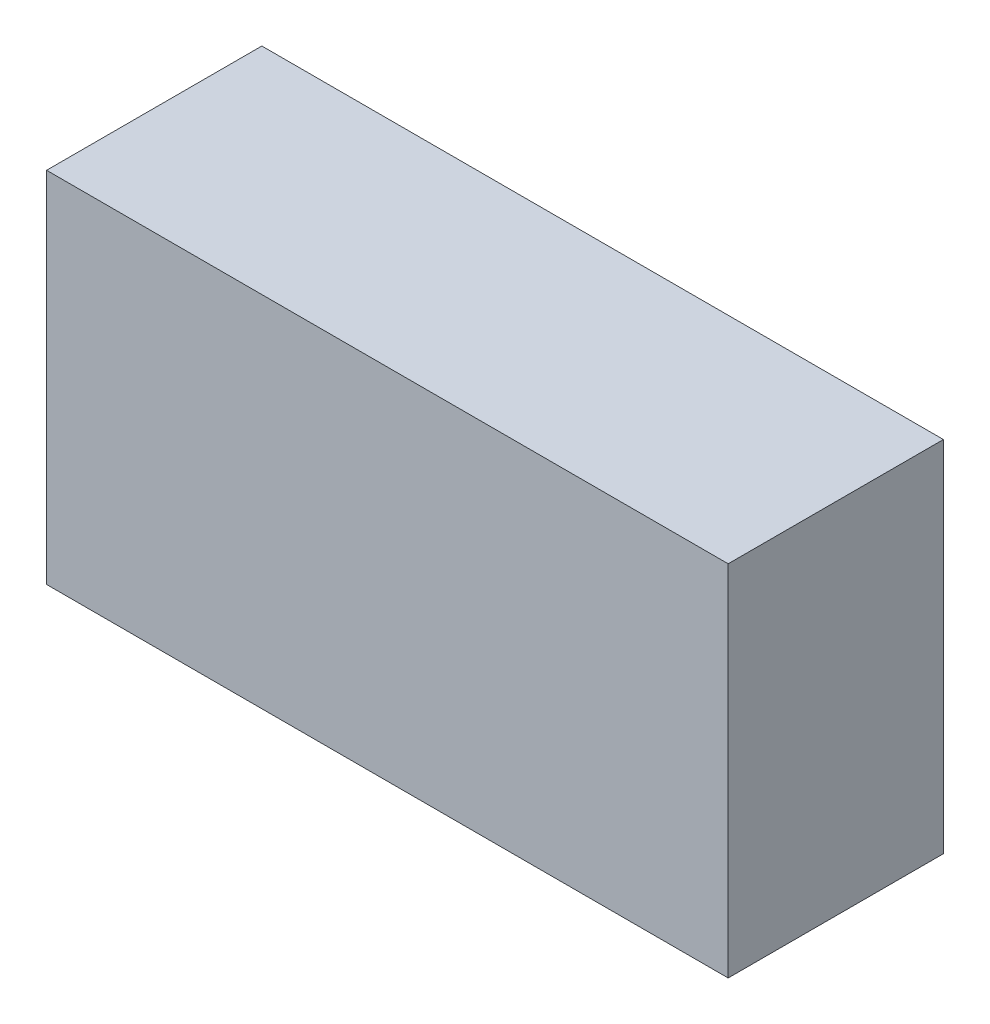
ISO-10303-21;
HEADER;
FILE_DESCRIPTION(('STEP AP214'),'2;1');
FILE_NAME('part.step','',(''),(''),'','','');
FILE_SCHEMA(('AUTOMOTIVE_DESIGN { 1 0 10303 214 1 1 1 1 }'));
ENDSEC;
DATA;
#1=APPLICATION_CONTEXT('core data for automotive mechanical design processes');
#2=APPLICATION_PROTOCOL_DEFINITION('international standard','automotive_design',2000,#1);
#3=PRODUCT_CONTEXT('',#1,'mechanical');
#4=PRODUCT('Part','Part','',(#3));
#5=PRODUCT_RELATED_PRODUCT_CATEGORY('part','',(#4));
#6=PRODUCT_DEFINITION_FORMATION('','',#4);
#7=PRODUCT_DEFINITION_CONTEXT('part definition',#1,'design');
#8=PRODUCT_DEFINITION('design','',#6,#7);
#9=PRODUCT_DEFINITION_SHAPE('','',#8);
#10=(LENGTH_UNIT() NAMED_UNIT(*) SI_UNIT(.MILLI.,.METRE.));
#11=(NAMED_UNIT(*) PLANE_ANGLE_UNIT() SI_UNIT($,.RADIAN.));
#12=(NAMED_UNIT(*) SI_UNIT($,.STERADIAN.) SOLID_ANGLE_UNIT());
#13=UNCERTAINTY_MEASURE_WITH_UNIT(LENGTH_MEASURE(1.E-05),#10,'distance_accuracy_value','');
#14=(GEOMETRIC_REPRESENTATION_CONTEXT(3) GLOBAL_UNCERTAINTY_ASSIGNED_CONTEXT((#13)) GLOBAL_UNIT_ASSIGNED_CONTEXT((#10,
#11,#12)) REPRESENTATION_CONTEXT('',''));
#15=CARTESIAN_POINT('',(0.,0.,0.));
#16=DIRECTION('',(0.,0.,1.));
#17=DIRECTION('',(1.,0.,0.));
#18=AXIS2_PLACEMENT_3D('',#15,#16,#17);
#19=CARTESIAN_POINT('',(190.,200.,60.));
#20=DIRECTION('',(-1.,0.,0.));
#21=DIRECTION('',(0.,0.,1.));
#22=AXIS2_PLACEMENT_3D('',#19,#20,#21);
#23=PLANE('',#22);
#24=DIRECTION('',(0.,0.,-1.));
#25=VECTOR('',#24,1.);
#26=CARTESIAN_POINT('',(190.,0.,60.));
#27=LINE('',#26,#25);
#28=CARTESIAN_POINT('',(190.,0.,60.));
#29=VERTEX_POINT('',#28);
#30=CARTESIAN_POINT('',(190.,0.,-60.));
#31=VERTEX_POINT('',#30);
#32=EDGE_CURVE('E96',#29,#31,#27,.T.);
#33=ORIENTED_EDGE('',*,*,#32,.T.);
#34=DIRECTION('',(0.,-1.,0.));
#35=VECTOR('',#34,1.);
#36=CARTESIAN_POINT('',(190.,200.,-60.));
#37=LINE('',#36,#35);
#38=CARTESIAN_POINT('',(190.,200.,-60.));
#39=VERTEX_POINT('',#38);
#40=EDGE_CURVE('E11',#39,#31,#37,.T.);
#41=ORIENTED_EDGE('',*,*,#40,.F.);
#42=DIRECTION('',(0.,0.,-1.));
#43=VECTOR('',#42,1.);
#44=CARTESIAN_POINT('',(190.,200.,60.));
#45=LINE('',#44,#43);
#46=CARTESIAN_POINT('',(190.,200.,60.));
#47=VERTEX_POINT('',#46);
#48=EDGE_CURVE('E84',#47,#39,#45,.T.);
#49=ORIENTED_EDGE('',*,*,#48,.F.);
#50=DIRECTION('',(0.,-1.,0.));
#51=VECTOR('',#50,1.);
#52=CARTESIAN_POINT('',(190.,200.,60.));
#53=LINE('',#52,#51);
#54=EDGE_CURVE('E92',#47,#29,#53,.T.);
#55=ORIENTED_EDGE('',*,*,#54,.T.);
#56=EDGE_LOOP('',(#33,#41,#49,#55));
#57=FACE_BOUND('',#56,.T.);
#58=ADVANCED_FACE('F33',(#57),#23,.F.);
#59=CARTESIAN_POINT('',(-190.,200.,-60.));
#60=DIRECTION('',(0.,0.,1.));
#61=DIRECTION('',(1.,0.,0.));
#62=AXIS2_PLACEMENT_3D('',#59,#60,#61);
#63=PLANE('',#62);
#64=DIRECTION('',(-1.,0.,0.));
#65=VECTOR('',#64,1.);
#66=CARTESIAN_POINT('',(-190.,0.,-60.));
#67=LINE('',#66,#65);
#68=CARTESIAN_POINT('',(-190.,0.,-60.));
#69=VERTEX_POINT('',#68);
#70=EDGE_CURVE('E88',#31,#69,#67,.T.);
#71=ORIENTED_EDGE('',*,*,#70,.T.);
#72=DIRECTION('',(0.,-1.,0.));
#73=VECTOR('',#72,1.);
#74=CARTESIAN_POINT('',(-190.,200.,-60.));
#75=LINE('',#74,#73);
#76=CARTESIAN_POINT('',(-190.,200.,-60.));
#77=VERTEX_POINT('',#76);
#78=EDGE_CURVE('E41',#77,#69,#75,.T.);
#79=ORIENTED_EDGE('',*,*,#78,.F.);
#80=DIRECTION('',(-1.,0.,0.));
#81=VECTOR('',#80,1.);
#82=CARTESIAN_POINT('',(-190.,200.,-60.));
#83=LINE('',#82,#81);
#84=EDGE_CURVE('E79',#39,#77,#83,.T.);
#85=ORIENTED_EDGE('',*,*,#84,.F.);
#86=ORIENTED_EDGE('',*,*,#40,.T.);
#87=EDGE_LOOP('',(#71,#79,#85,#86));
#88=FACE_BOUND('',#87,.T.);
#89=ADVANCED_FACE('F87',(#88),#63,.F.);
#90=CARTESIAN_POINT('',(-190.,200.,60.));
#91=DIRECTION('',(1.,0.,0.));
#92=DIRECTION('',(0.,0.,-1.));
#93=AXIS2_PLACEMENT_3D('',#90,#91,#92);
#94=PLANE('',#93);
#95=DIRECTION('',(0.,0.,1.));
#96=VECTOR('',#95,1.);
#97=CARTESIAN_POINT('',(-190.,0.,60.));
#98=LINE('',#97,#96);
#99=CARTESIAN_POINT('',(-190.,0.,60.));
#100=VERTEX_POINT('',#99);
#101=EDGE_CURVE('E66',#69,#100,#98,.T.);
#102=ORIENTED_EDGE('',*,*,#101,.T.);
#103=DIRECTION('',(0.,-1.,0.));
#104=VECTOR('',#103,1.);
#105=CARTESIAN_POINT('',(-190.,200.,60.));
#106=LINE('',#105,#104);
#107=CARTESIAN_POINT('',(-190.,200.,60.));
#108=VERTEX_POINT('',#107);
#109=EDGE_CURVE('E89',#108,#100,#106,.T.);
#110=ORIENTED_EDGE('',*,*,#109,.F.);
#111=DIRECTION('',(0.,0.,1.));
#112=VECTOR('',#111,1.);
#113=CARTESIAN_POINT('',(-190.,200.,60.));
#114=LINE('',#113,#112);
#115=EDGE_CURVE('E82',#77,#108,#114,.T.);
#116=ORIENTED_EDGE('',*,*,#115,.F.);
#117=ORIENTED_EDGE('',*,*,#78,.T.);
#118=EDGE_LOOP('',(#102,#110,#116,#117));
#119=FACE_BOUND('',#118,.T.);
#120=ADVANCED_FACE('F90',(#119),#94,.F.);
#121=CARTESIAN_POINT('',(-190.,200.,60.));
#122=DIRECTION('',(0.,0.,-1.));
#123=DIRECTION('',(-1.,0.,0.));
#124=AXIS2_PLACEMENT_3D('',#121,#122,#123);
#125=PLANE('',#124);
#126=DIRECTION('',(1.,0.,0.));
#127=VECTOR('',#126,1.);
#128=CARTESIAN_POINT('',(-190.,0.,60.));
#129=LINE('',#128,#127);
#130=EDGE_CURVE('E72',#100,#29,#129,.T.);
#131=ORIENTED_EDGE('',*,*,#130,.T.);
#132=ORIENTED_EDGE('',*,*,#54,.F.);
#133=DIRECTION('',(1.,0.,0.));
#134=VECTOR('',#133,1.);
#135=CARTESIAN_POINT('',(-190.,200.,60.));
#136=LINE('',#135,#134);
#137=EDGE_CURVE('E49',#108,#47,#136,.T.);
#138=ORIENTED_EDGE('',*,*,#137,.F.);
#139=ORIENTED_EDGE('',*,*,#109,.T.);
#140=EDGE_LOOP('',(#131,#132,#138,#139));
#141=FACE_BOUND('',#140,.T.);
#142=ADVANCED_FACE('F103',(#141),#125,.F.);
#143=CARTESIAN_POINT('',(0.,200.,0.));
#144=DIRECTION('',(0.,-1.,0.));
#145=DIRECTION('',(0.,0.,-1.));
#146=AXIS2_PLACEMENT_3D('',#143,#144,#145);
#147=PLANE('',#146);
#148=ORIENTED_EDGE('',*,*,#48,.T.);
#149=ORIENTED_EDGE('',*,*,#84,.T.);
#150=ORIENTED_EDGE('',*,*,#115,.T.);
#151=ORIENTED_EDGE('',*,*,#137,.T.);
#152=EDGE_LOOP('',(#148,#149,#150,#151));
#153=FACE_BOUND('',#152,.T.);
#154=ADVANCED_FACE('F80',(#153),#147,.F.);
#155=CARTESIAN_POINT('',(0.,0.,0.));
#156=DIRECTION('',(0.,-1.,0.));
#157=DIRECTION('',(0.,0.,-1.));
#158=AXIS2_PLACEMENT_3D('',#155,#156,#157);
#159=PLANE('',#158);
#160=ORIENTED_EDGE('',*,*,#32,.F.);
#161=ORIENTED_EDGE('',*,*,#130,.F.);
#162=ORIENTED_EDGE('',*,*,#101,.F.);
#163=ORIENTED_EDGE('',*,*,#70,.F.);
#164=EDGE_LOOP('',(#160,#161,#162,#163));
#165=FACE_BOUND('',#164,.T.);
#166=ADVANCED_FACE('F106',(#165),#159,.T.);
#167=CLOSED_SHELL('',(#58,#89,#120,#142,#154,#166));
#168=MANIFOLD_SOLID_BREP('B2',#167);
#169=ADVANCED_BREP_SHAPE_REPRESENTATION('',(#18,#168),#14);
#170=SHAPE_DEFINITION_REPRESENTATION(#9,#169);
ENDSEC;
END-ISO-10303-21;
